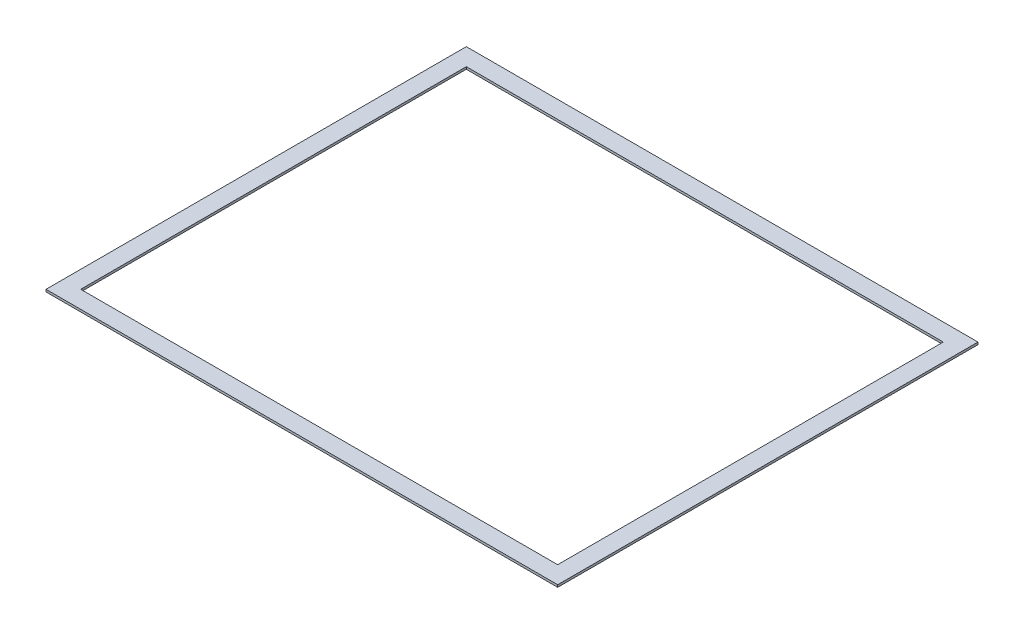
ISO-10303-21;
HEADER;
FILE_DESCRIPTION(('STEP AP214'),'2;1');
FILE_NAME('part.step','',(''),(''),'','','');
FILE_SCHEMA(('AUTOMOTIVE_DESIGN { 1 0 10303 214 1 1 1 1 }'));
ENDSEC;
DATA;
#1=APPLICATION_CONTEXT('core data for automotive mechanical design processes');
#2=APPLICATION_PROTOCOL_DEFINITION('international standard','automotive_design',2000,#1);
#3=PRODUCT_CONTEXT('',#1,'mechanical');
#4=PRODUCT('Part','Part','',(#3));
#5=PRODUCT_RELATED_PRODUCT_CATEGORY('part','',(#4));
#6=PRODUCT_DEFINITION_FORMATION('','',#4);
#7=PRODUCT_DEFINITION_CONTEXT('part definition',#1,'design');
#8=PRODUCT_DEFINITION('design','',#6,#7);
#9=PRODUCT_DEFINITION_SHAPE('','',#8);
#10=(LENGTH_UNIT() NAMED_UNIT(*) SI_UNIT(.MILLI.,.METRE.));
#11=(NAMED_UNIT(*) PLANE_ANGLE_UNIT() SI_UNIT($,.RADIAN.));
#12=(NAMED_UNIT(*) SI_UNIT($,.STERADIAN.) SOLID_ANGLE_UNIT());
#13=UNCERTAINTY_MEASURE_WITH_UNIT(LENGTH_MEASURE(1.E-05),#10,'distance_accuracy_value','');
#14=(GEOMETRIC_REPRESENTATION_CONTEXT(3) GLOBAL_UNCERTAINTY_ASSIGNED_CONTEXT((#13)) GLOBAL_UNIT_ASSIGNED_CONTEXT((#10,
#11,#12)) REPRESENTATION_CONTEXT('',''));
#15=CARTESIAN_POINT('',(0.,0.,0.));
#16=DIRECTION('',(0.,0.,1.));
#17=DIRECTION('',(1.,0.,0.));
#18=AXIS2_PLACEMENT_3D('',#15,#16,#17);
#19=CARTESIAN_POINT('',(0.,1.25,0.));
#20=DIRECTION('',(-1.,0.,0.));
#21=DIRECTION('',(0.,0.,1.));
#22=AXIS2_PLACEMENT_3D('',#19,#20,#21);
#23=PLANE('',#22);
#24=DIRECTION('',(0.,0.,-1.));
#25=VECTOR('',#24,1.);
#26=CARTESIAN_POINT('',(0.,0.,0.));
#27=LINE('',#26,#25);
#28=CARTESIAN_POINT('',(0.,0.,0.));
#29=VERTEX_POINT('',#28);
#30=CARTESIAN_POINT('',(0.,0.,-230.));
#31=VERTEX_POINT('',#30);
#32=EDGE_CURVE('E133',#29,#31,#27,.T.);
#33=ORIENTED_EDGE('',*,*,#32,.T.);
#34=DIRECTION('',(0.,-1.,0.));
#35=VECTOR('',#34,1.);
#36=CARTESIAN_POINT('',(0.,1.25,-230.));
#37=LINE('',#36,#35);
#38=CARTESIAN_POINT('',(0.,1.25,-230.));
#39=VERTEX_POINT('',#38);
#40=EDGE_CURVE('E11',#39,#31,#37,.T.);
#41=ORIENTED_EDGE('',*,*,#40,.F.);
#42=DIRECTION('',(0.,0.,-1.));
#43=VECTOR('',#42,1.);
#44=CARTESIAN_POINT('',(0.,1.25,0.));
#45=LINE('',#44,#43);
#46=CARTESIAN_POINT('',(0.,1.25,0.));
#47=VERTEX_POINT('',#46);
#48=EDGE_CURVE('E137',#47,#39,#45,.T.);
#49=ORIENTED_EDGE('',*,*,#48,.F.);
#50=DIRECTION('',(0.,-1.,0.));
#51=VECTOR('',#50,1.);
#52=CARTESIAN_POINT('',(0.,1.25,0.));
#53=LINE('',#52,#51);
#54=EDGE_CURVE('E147',#47,#29,#53,.T.);
#55=ORIENTED_EDGE('',*,*,#54,.T.);
#56=EDGE_LOOP('',(#33,#41,#49,#55));
#57=FACE_BOUND('',#56,.T.);
#58=ADVANCED_FACE('F36',(#57),#23,.F.);
#59=CARTESIAN_POINT('',(0.,1.25,-230.));
#60=DIRECTION('',(0.,0.,1.));
#61=DIRECTION('',(1.,0.,0.));
#62=AXIS2_PLACEMENT_3D('',#59,#60,#61);
#63=PLANE('',#62);
#64=DIRECTION('',(-1.,0.,0.));
#65=VECTOR('',#64,1.);
#66=CARTESIAN_POINT('',(0.,0.,-230.));
#67=LINE('',#66,#65);
#68=CARTESIAN_POINT('',(-280.,0.,-230.));
#69=VERTEX_POINT('',#68);
#70=EDGE_CURVE('E150',#31,#69,#67,.T.);
#71=ORIENTED_EDGE('',*,*,#70,.T.);
#72=DIRECTION('',(0.,-1.,0.));
#73=VECTOR('',#72,1.);
#74=CARTESIAN_POINT('',(-280.,1.25,-230.));
#75=LINE('',#74,#73);
#76=CARTESIAN_POINT('',(-280.,1.25,-230.));
#77=VERTEX_POINT('',#76);
#78=EDGE_CURVE('E43',#77,#69,#75,.T.);
#79=ORIENTED_EDGE('',*,*,#78,.F.);
#80=DIRECTION('',(-1.,0.,0.));
#81=VECTOR('',#80,1.);
#82=CARTESIAN_POINT('',(0.,1.25,-230.));
#83=LINE('',#82,#81);
#84=EDGE_CURVE('E140',#39,#77,#83,.T.);
#85=ORIENTED_EDGE('',*,*,#84,.F.);
#86=ORIENTED_EDGE('',*,*,#40,.T.);
#87=EDGE_LOOP('',(#71,#79,#85,#86));
#88=FACE_BOUND('',#87,.T.);
#89=ADVANCED_FACE('F178',(#88),#63,.F.);
#90=CARTESIAN_POINT('',(-280.,1.25,0.));
#91=DIRECTION('',(1.,0.,0.));
#92=DIRECTION('',(0.,0.,-1.));
#93=AXIS2_PLACEMENT_3D('',#90,#91,#92);
#94=PLANE('',#93);
#95=DIRECTION('',(0.,0.,1.));
#96=VECTOR('',#95,1.);
#97=CARTESIAN_POINT('',(-280.,0.,0.));
#98=LINE('',#97,#96);
#99=CARTESIAN_POINT('',(-280.,0.,0.));
#100=VERTEX_POINT('',#99);
#101=EDGE_CURVE('E152',#69,#100,#98,.T.);
#102=ORIENTED_EDGE('',*,*,#101,.T.);
#103=DIRECTION('',(0.,-1.,0.));
#104=VECTOR('',#103,1.);
#105=CARTESIAN_POINT('',(-280.,1.25,0.));
#106=LINE('',#105,#104);
#107=CARTESIAN_POINT('',(-280.,1.25,0.));
#108=VERTEX_POINT('',#107);
#109=EDGE_CURVE('E157',#108,#100,#106,.T.);
#110=ORIENTED_EDGE('',*,*,#109,.F.);
#111=DIRECTION('',(0.,0.,1.));
#112=VECTOR('',#111,1.);
#113=CARTESIAN_POINT('',(-280.,1.25,0.));
#114=LINE('',#113,#112);
#115=EDGE_CURVE('E143',#77,#108,#114,.T.);
#116=ORIENTED_EDGE('',*,*,#115,.F.);
#117=ORIENTED_EDGE('',*,*,#78,.T.);
#118=EDGE_LOOP('',(#102,#110,#116,#117));
#119=FACE_BOUND('',#118,.T.);
#120=ADVANCED_FACE('F164',(#119),#94,.F.);
#121=CARTESIAN_POINT('',(0.,1.25,0.));
#122=DIRECTION('',(0.,0.,-1.));
#123=DIRECTION('',(-1.,0.,0.));
#124=AXIS2_PLACEMENT_3D('',#121,#122,#123);
#125=PLANE('',#124);
#126=DIRECTION('',(1.,0.,0.));
#127=VECTOR('',#126,1.);
#128=CARTESIAN_POINT('',(0.,0.,0.));
#129=LINE('',#128,#127);
#130=EDGE_CURVE('E141',#100,#29,#129,.T.);
#131=ORIENTED_EDGE('',*,*,#130,.T.);
#132=ORIENTED_EDGE('',*,*,#54,.F.);
#133=DIRECTION('',(1.,0.,0.));
#134=VECTOR('',#133,1.);
#135=CARTESIAN_POINT('',(0.,1.25,0.));
#136=LINE('',#135,#134);
#137=EDGE_CURVE('E145',#108,#47,#136,.T.);
#138=ORIENTED_EDGE('',*,*,#137,.F.);
#139=ORIENTED_EDGE('',*,*,#109,.T.);
#140=EDGE_LOOP('',(#131,#132,#138,#139));
#141=FACE_BOUND('',#140,.T.);
#142=ADVANCED_FACE('F171',(#141),#125,.F.);
#143=CARTESIAN_POINT('',(0.,1.25,0.));
#144=DIRECTION('',(0.,1.,0.));
#145=DIRECTION('',(0.,0.,1.));
#146=AXIS2_PLACEMENT_3D('',#143,#144,#145);
#147=PLANE('',#146);
#148=DIRECTION('',(0.,0.,-1.));
#149=VECTOR('',#148,1.);
#150=CARTESIAN_POINT('',(-9.5,1.25,-9.50000000000003));
#151=LINE('',#150,#149);
#152=CARTESIAN_POINT('',(-9.5,1.25,-9.50000000000003));
#153=VERTEX_POINT('',#152);
#154=CARTESIAN_POINT('',(-9.5,1.25,-220.5));
#155=VERTEX_POINT('',#154);
#156=EDGE_CURVE('E50',#153,#155,#151,.T.);
#157=ORIENTED_EDGE('',*,*,#156,.F.);
#158=DIRECTION('',(1.,0.,0.));
#159=VECTOR('',#158,1.);
#160=CARTESIAN_POINT('',(-270.5,1.25,-9.50000000000003));
#161=LINE('',#160,#159);
#162=CARTESIAN_POINT('',(-270.5,1.25,-9.50000000000003));
#163=VERTEX_POINT('',#162);
#164=EDGE_CURVE('E118',#163,#153,#161,.T.);
#165=ORIENTED_EDGE('',*,*,#164,.F.);
#166=DIRECTION('',(0.,0.,1.));
#167=VECTOR('',#166,1.);
#168=CARTESIAN_POINT('',(-270.5,1.25,-9.50000000000003));
#169=LINE('',#168,#167);
#170=CARTESIAN_POINT('',(-270.5,1.25,-220.5));
#171=VERTEX_POINT('',#170);
#172=EDGE_CURVE('E121',#171,#163,#169,.T.);
#173=ORIENTED_EDGE('',*,*,#172,.F.);
#174=DIRECTION('',(-1.,0.,0.));
#175=VECTOR('',#174,1.);
#176=CARTESIAN_POINT('',(-270.5,1.25,-220.5));
#177=LINE('',#176,#175);
#178=EDGE_CURVE('E127',#155,#171,#177,.T.);
#179=ORIENTED_EDGE('',*,*,#178,.F.);
#180=EDGE_LOOP('',(#157,#165,#173,#179));
#181=FACE_BOUND('',#180,.T.);
#182=ORIENTED_EDGE('',*,*,#48,.T.);
#183=ORIENTED_EDGE('',*,*,#84,.T.);
#184=ORIENTED_EDGE('',*,*,#115,.T.);
#185=ORIENTED_EDGE('',*,*,#137,.T.);
#186=EDGE_LOOP('',(#182,#183,#184,#185));
#187=FACE_BOUND('',#186,.T.);
#188=ADVANCED_FACE('F177',(#181,#187),#147,.T.);
#189=CARTESIAN_POINT('',(0.,0.,0.));
#190=DIRECTION('',(0.,1.,0.));
#191=DIRECTION('',(0.,0.,1.));
#192=AXIS2_PLACEMENT_3D('',#189,#190,#191);
#193=PLANE('',#192);
#194=DIRECTION('',(1.,0.,0.));
#195=VECTOR('',#194,1.);
#196=CARTESIAN_POINT('',(-270.5,0.,-9.50000000000003));
#197=LINE('',#196,#195);
#198=CARTESIAN_POINT('',(-270.5,0.,-9.50000000000003));
#199=VERTEX_POINT('',#198);
#200=CARTESIAN_POINT('',(-9.5,0.,-9.50000000000003));
#201=VERTEX_POINT('',#200);
#202=EDGE_CURVE('E108',#199,#201,#197,.T.);
#203=ORIENTED_EDGE('',*,*,#202,.T.);
#204=DIRECTION('',(0.,0.,-1.));
#205=VECTOR('',#204,1.);
#206=CARTESIAN_POINT('',(-9.5,0.,-9.50000000000003));
#207=LINE('',#206,#205);
#208=CARTESIAN_POINT('',(-9.5,0.,-220.5));
#209=VERTEX_POINT('',#208);
#210=EDGE_CURVE('E102',#201,#209,#207,.T.);
#211=ORIENTED_EDGE('',*,*,#210,.T.);
#212=DIRECTION('',(-1.,0.,0.));
#213=VECTOR('',#212,1.);
#214=CARTESIAN_POINT('',(-270.5,0.,-220.5));
#215=LINE('',#214,#213);
#216=CARTESIAN_POINT('',(-270.5,0.,-220.5));
#217=VERTEX_POINT('',#216);
#218=EDGE_CURVE('E111',#209,#217,#215,.T.);
#219=ORIENTED_EDGE('',*,*,#218,.T.);
#220=DIRECTION('',(0.,0.,1.));
#221=VECTOR('',#220,1.);
#222=CARTESIAN_POINT('',(-270.5,0.,-9.50000000000003));
#223=LINE('',#222,#221);
#224=EDGE_CURVE('E58',#217,#199,#223,.T.);
#225=ORIENTED_EDGE('',*,*,#224,.T.);
#226=EDGE_LOOP('',(#203,#211,#219,#225));
#227=FACE_BOUND('',#226,.T.);
#228=ORIENTED_EDGE('',*,*,#32,.F.);
#229=ORIENTED_EDGE('',*,*,#130,.F.);
#230=ORIENTED_EDGE('',*,*,#101,.F.);
#231=ORIENTED_EDGE('',*,*,#70,.F.);
#232=EDGE_LOOP('',(#228,#229,#230,#231));
#233=FACE_BOUND('',#232,.T.);
#234=ADVANCED_FACE('F115',(#227,#233),#193,.F.);
#235=CARTESIAN_POINT('',(-9.5,0.,-9.50000000000003));
#236=DIRECTION('',(1.,0.,0.));
#237=DIRECTION('',(0.,0.,-1.));
#238=AXIS2_PLACEMENT_3D('',#235,#236,#237);
#239=PLANE('',#238);
#240=ORIENTED_EDGE('',*,*,#156,.T.);
#241=DIRECTION('',(0.,1.,0.));
#242=VECTOR('',#241,1.);
#243=CARTESIAN_POINT('',(-9.5,0.,-220.5));
#244=LINE('',#243,#242);
#245=EDGE_CURVE('E98',#209,#155,#244,.T.);
#246=ORIENTED_EDGE('',*,*,#245,.F.);
#247=ORIENTED_EDGE('',*,*,#210,.F.);
#248=DIRECTION('',(0.,1.,0.));
#249=VECTOR('',#248,1.);
#250=CARTESIAN_POINT('',(-9.5,0.,-9.50000000000003));
#251=LINE('',#250,#249);
#252=EDGE_CURVE('E131',#201,#153,#251,.T.);
#253=ORIENTED_EDGE('',*,*,#252,.T.);
#254=EDGE_LOOP('',(#240,#246,#247,#253));
#255=FACE_BOUND('',#254,.T.);
#256=ADVANCED_FACE('F100',(#255),#239,.F.);
#257=CARTESIAN_POINT('',(-270.5,0.,-9.50000000000003));
#258=DIRECTION('',(0.,0.,1.));
#259=DIRECTION('',(1.,0.,0.));
#260=AXIS2_PLACEMENT_3D('',#257,#258,#259);
#261=PLANE('',#260);
#262=ORIENTED_EDGE('',*,*,#164,.T.);
#263=ORIENTED_EDGE('',*,*,#252,.F.);
#264=ORIENTED_EDGE('',*,*,#202,.F.);
#265=DIRECTION('',(0.,1.,0.));
#266=VECTOR('',#265,1.);
#267=CARTESIAN_POINT('',(-270.5,0.,-9.50000000000003));
#268=LINE('',#267,#266);
#269=EDGE_CURVE('E134',#199,#163,#268,.T.);
#270=ORIENTED_EDGE('',*,*,#269,.T.);
#271=EDGE_LOOP('',(#262,#263,#264,#270));
#272=FACE_BOUND('',#271,.T.);
#273=ADVANCED_FACE('F195',(#272),#261,.F.);
#274=CARTESIAN_POINT('',(-270.5,0.,-9.50000000000003));
#275=DIRECTION('',(-1.,0.,0.));
#276=DIRECTION('',(0.,0.,1.));
#277=AXIS2_PLACEMENT_3D('',#274,#275,#276);
#278=PLANE('',#277);
#279=ORIENTED_EDGE('',*,*,#172,.T.);
#280=ORIENTED_EDGE('',*,*,#269,.F.);
#281=ORIENTED_EDGE('',*,*,#224,.F.);
#282=DIRECTION('',(0.,1.,0.));
#283=VECTOR('',#282,1.);
#284=CARTESIAN_POINT('',(-270.5,0.,-220.5));
#285=LINE('',#284,#283);
#286=EDGE_CURVE('E107',#217,#171,#285,.T.);
#287=ORIENTED_EDGE('',*,*,#286,.T.);
#288=EDGE_LOOP('',(#279,#280,#281,#287));
#289=FACE_BOUND('',#288,.T.);
#290=ADVANCED_FACE('F198',(#289),#278,.F.);
#291=CARTESIAN_POINT('',(-270.5,0.,-220.5));
#292=DIRECTION('',(0.,0.,-1.));
#293=DIRECTION('',(-1.,0.,0.));
#294=AXIS2_PLACEMENT_3D('',#291,#292,#293);
#295=PLANE('',#294);
#296=ORIENTED_EDGE('',*,*,#178,.T.);
#297=ORIENTED_EDGE('',*,*,#286,.F.);
#298=ORIENTED_EDGE('',*,*,#218,.F.);
#299=ORIENTED_EDGE('',*,*,#245,.T.);
#300=EDGE_LOOP('',(#296,#297,#298,#299));
#301=FACE_BOUND('',#300,.T.);
#302=ADVANCED_FACE('F112',(#301),#295,.F.);
#303=CLOSED_SHELL('',(#58,#89,#120,#142,#188,#234,#256,#273,#290,#302));
#304=MANIFOLD_SOLID_BREP('B2',#303);
#305=ADVANCED_BREP_SHAPE_REPRESENTATION('',(#18,#304),#14);
#306=SHAPE_DEFINITION_REPRESENTATION(#9,#305);
ENDSEC;
END-ISO-10303-21;
